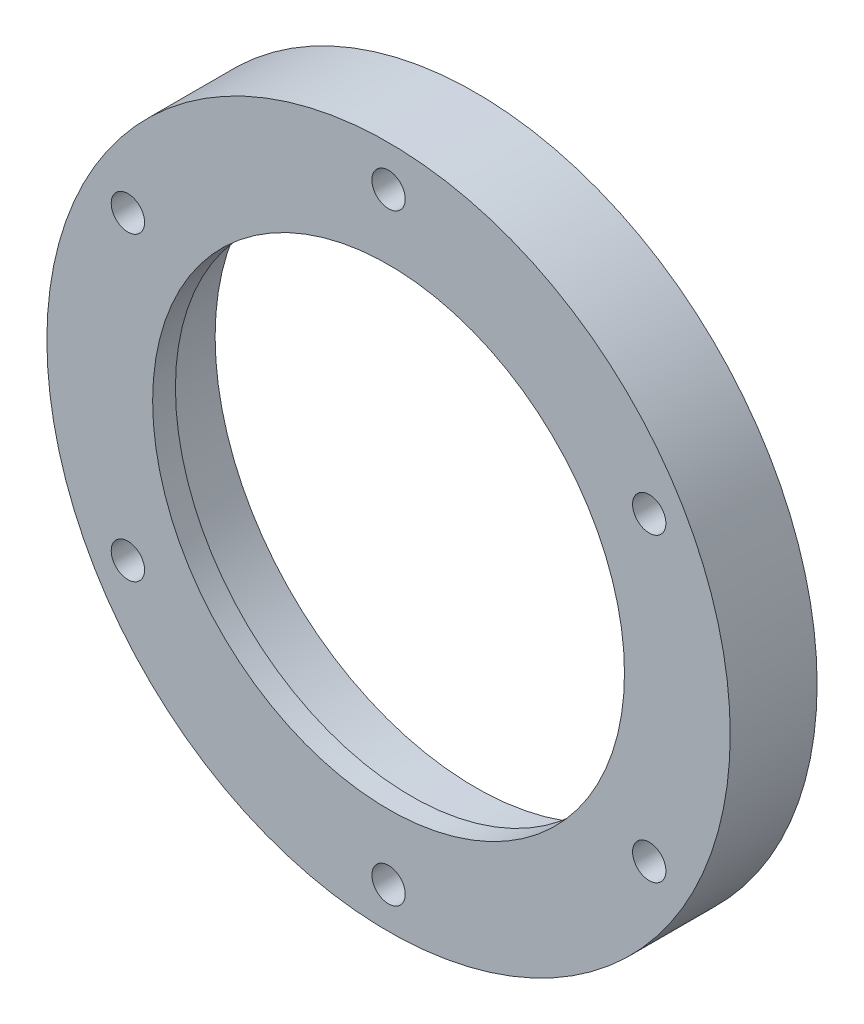
ISO-10303-21;
HEADER;
FILE_DESCRIPTION(('STEP AP214'),'2;1');
FILE_NAME('part.step','',(''),(''),'','','');
FILE_SCHEMA(('AUTOMOTIVE_DESIGN { 1 0 10303 214 1 1 1 1 }'));
ENDSEC;
DATA;
#1=APPLICATION_CONTEXT('core data for automotive mechanical design processes');
#2=APPLICATION_PROTOCOL_DEFINITION('international standard','automotive_design',2000,#1);
#3=PRODUCT_CONTEXT('',#1,'mechanical');
#4=PRODUCT('Part','Part','',(#3));
#5=PRODUCT_RELATED_PRODUCT_CATEGORY('part','',(#4));
#6=PRODUCT_DEFINITION_FORMATION('','',#4);
#7=PRODUCT_DEFINITION_CONTEXT('part definition',#1,'design');
#8=PRODUCT_DEFINITION('design','',#6,#7);
#9=PRODUCT_DEFINITION_SHAPE('','',#8);
#10=(LENGTH_UNIT() NAMED_UNIT(*) SI_UNIT(.MILLI.,.METRE.));
#11=(NAMED_UNIT(*) PLANE_ANGLE_UNIT() SI_UNIT($,.RADIAN.));
#12=(NAMED_UNIT(*) SI_UNIT($,.STERADIAN.) SOLID_ANGLE_UNIT());
#13=UNCERTAINTY_MEASURE_WITH_UNIT(LENGTH_MEASURE(1.E-05),#10,'distance_accuracy_value','');
#14=(GEOMETRIC_REPRESENTATION_CONTEXT(3) GLOBAL_UNCERTAINTY_ASSIGNED_CONTEXT((#13)) GLOBAL_UNIT_ASSIGNED_CONTEXT((#10,
#11,#12)) REPRESENTATION_CONTEXT('',''));
#15=CARTESIAN_POINT('',(0.,0.,0.));
#16=DIRECTION('',(0.,0.,1.));
#17=DIRECTION('',(1.,0.,0.));
#18=AXIS2_PLACEMENT_3D('',#15,#16,#17);
#19=CARTESIAN_POINT('',(0.,0.,-1.97));
#20=DIRECTION('',(0.,0.,1.));
#21=DIRECTION('',(1.,0.,0.));
#22=AXIS2_PLACEMENT_3D('',#19,#20,#21);
#23=PLANE('',#22);
#24=CARTESIAN_POINT('',(-16.021469970012,9.25000000000019,-1.97));
#25=DIRECTION('',(0.,0.,-1.));
#26=DIRECTION('',(-1.,0.,0.));
#27=AXIS2_PLACEMENT_3D('',#24,#25,#26);
#28=CIRCLE('',#27,1.02499999999999);
#29=CARTESIAN_POINT('',(-17.046469970012,9.25000000000019,-1.97));
#30=VERTEX_POINT('',#29);
#31=EDGE_CURVE('E95',#30,#30,#28,.T.);
#32=ORIENTED_EDGE('',*,*,#31,.F.);
#33=EDGE_LOOP('',(#32));
#34=FACE_BOUND('',#33,.T.);
#35=CARTESIAN_POINT('',(-16.0214699700122,-9.24999999999985,-1.97));
#36=DIRECTION('',(0.,0.,-1.));
#37=DIRECTION('',(-1.,0.,0.));
#38=AXIS2_PLACEMENT_3D('',#35,#36,#37);
#39=CIRCLE('',#38,1.02499999999999);
#40=CARTESIAN_POINT('',(-17.0464699700122,-9.24999999999985,-1.97));
#41=VERTEX_POINT('',#40);
#42=EDGE_CURVE('E89',#41,#41,#39,.T.);
#43=ORIENTED_EDGE('',*,*,#42,.F.);
#44=EDGE_LOOP('',(#43));
#45=FACE_BOUND('',#44,.T.);
#46=CARTESIAN_POINT('',(0.,-18.5,-1.97));
#47=DIRECTION('',(0.,0.,-1.));
#48=DIRECTION('',(-1.,0.,0.));
#49=AXIS2_PLACEMENT_3D('',#46,#47,#48);
#50=CIRCLE('',#49,1.02499999999999);
#51=CARTESIAN_POINT('',(-1.02499999999999,-18.5,-1.97));
#52=VERTEX_POINT('',#51);
#53=EDGE_CURVE('E83',#52,#52,#50,.T.);
#54=ORIENTED_EDGE('',*,*,#53,.F.);
#55=EDGE_LOOP('',(#54));
#56=FACE_BOUND('',#55,.T.);
#57=CARTESIAN_POINT('',(16.0214699700121,9.24999999999996,-1.97));
#58=DIRECTION('',(0.,0.,-1.));
#59=DIRECTION('',(-1.,0.,0.));
#60=AXIS2_PLACEMENT_3D('',#57,#58,#59);
#61=CIRCLE('',#60,1.02499999999999);
#62=CARTESIAN_POINT('',(14.9964699700121,9.24999999999996,-1.97));
#63=VERTEX_POINT('',#62);
#64=EDGE_CURVE('E71',#63,#63,#61,.T.);
#65=ORIENTED_EDGE('',*,*,#64,.F.);
#66=EDGE_LOOP('',(#65));
#67=FACE_BOUND('',#66,.T.);
#68=CARTESIAN_POINT('',(0.,18.5,-1.97));
#69=DIRECTION('',(0.,0.,-1.));
#70=DIRECTION('',(-1.,0.,0.));
#71=AXIS2_PLACEMENT_3D('',#68,#69,#70);
#72=CIRCLE('',#71,1.02499999999999);
#73=CARTESIAN_POINT('',(-1.02499999999999,18.5,-1.97));
#74=VERTEX_POINT('',#73);
#75=EDGE_CURVE('E65',#74,#74,#72,.T.);
#76=ORIENTED_EDGE('',*,*,#75,.F.);
#77=EDGE_LOOP('',(#76));
#78=FACE_BOUND('',#77,.T.);
#79=CARTESIAN_POINT('',(0.,0.,-1.97));
#80=DIRECTION('',(0.,0.,1.));
#81=DIRECTION('',(1.,0.,0.));
#82=AXIS2_PLACEMENT_3D('',#79,#80,#81);
#83=CIRCLE('',#82,21.);
#84=CARTESIAN_POINT('',(21.,0.,-1.97));
#85=VERTEX_POINT('',#84);
#86=EDGE_CURVE('E10',#85,#85,#83,.T.);
#87=ORIENTED_EDGE('',*,*,#86,.F.);
#88=EDGE_LOOP('',(#87));
#89=FACE_BOUND('',#88,.T.);
#90=CARTESIAN_POINT('',(0.,0.,-1.97));
#91=DIRECTION('',(0.,0.,1.));
#92=DIRECTION('',(1.,0.,0.));
#93=AXIS2_PLACEMENT_3D('',#90,#91,#92);
#94=CIRCLE('',#93,16.);
#95=CARTESIAN_POINT('',(16.,0.,-1.97));
#96=VERTEX_POINT('',#95);
#97=EDGE_CURVE('E43',#96,#96,#94,.T.);
#98=ORIENTED_EDGE('',*,*,#97,.T.);
#99=EDGE_LOOP('',(#98));
#100=FACE_BOUND('',#99,.T.);
#101=CARTESIAN_POINT('',(16.0214699700121,-9.25000000000008,-1.97));
#102=DIRECTION('',(0.,0.,-1.));
#103=DIRECTION('',(-1.,0.,0.));
#104=AXIS2_PLACEMENT_3D('',#101,#102,#103);
#105=CIRCLE('',#104,1.02499999999999);
#106=CARTESIAN_POINT('',(14.9964699700121,-9.25000000000008,-1.97));
#107=VERTEX_POINT('',#106);
#108=EDGE_CURVE('E77',#107,#107,#105,.T.);
#109=ORIENTED_EDGE('',*,*,#108,.F.);
#110=EDGE_LOOP('',(#109));
#111=FACE_BOUND('',#110,.T.);
#112=ADVANCED_FACE('F36',(#34,#45,#56,#67,#78,#89,#100,#111),#23,.F.);
#113=CARTESIAN_POINT('',(0.,0.,3.37));
#114=DIRECTION('',(0.,0.,1.));
#115=DIRECTION('',(1.,0.,0.));
#116=AXIS2_PLACEMENT_3D('',#113,#114,#115);
#117=PLANE('',#116);
#118=CARTESIAN_POINT('',(-16.021469970012,9.25000000000019,3.37));
#119=DIRECTION('',(0.,0.,-1.));
#120=DIRECTION('',(-1.,0.,0.));
#121=AXIS2_PLACEMENT_3D('',#118,#119,#120);
#122=CIRCLE('',#121,1.025);
#123=CARTESIAN_POINT('',(-17.046469970012,9.25000000000019,3.37));
#124=VERTEX_POINT('',#123);
#125=EDGE_CURVE('E92',#124,#124,#122,.T.);
#126=ORIENTED_EDGE('',*,*,#125,.T.);
#127=EDGE_LOOP('',(#126));
#128=FACE_BOUND('',#127,.T.);
#129=CARTESIAN_POINT('',(-16.0214699700122,-9.24999999999985,3.37));
#130=DIRECTION('',(0.,0.,-1.));
#131=DIRECTION('',(-1.,0.,0.));
#132=AXIS2_PLACEMENT_3D('',#129,#130,#131);
#133=CIRCLE('',#132,1.025);
#134=CARTESIAN_POINT('',(-17.0464699700122,-9.24999999999985,3.37));
#135=VERTEX_POINT('',#134);
#136=EDGE_CURVE('E86',#135,#135,#133,.T.);
#137=ORIENTED_EDGE('',*,*,#136,.T.);
#138=EDGE_LOOP('',(#137));
#139=FACE_BOUND('',#138,.T.);
#140=CARTESIAN_POINT('',(0.,-18.5,3.37));
#141=DIRECTION('',(0.,0.,-1.));
#142=DIRECTION('',(-1.,0.,0.));
#143=AXIS2_PLACEMENT_3D('',#140,#141,#142);
#144=CIRCLE('',#143,1.025);
#145=CARTESIAN_POINT('',(-1.025,-18.5,3.37));
#146=VERTEX_POINT('',#145);
#147=EDGE_CURVE('E80',#146,#146,#144,.T.);
#148=ORIENTED_EDGE('',*,*,#147,.T.);
#149=EDGE_LOOP('',(#148));
#150=FACE_BOUND('',#149,.T.);
#151=CARTESIAN_POINT('',(16.0214699700121,-9.25000000000008,3.37));
#152=DIRECTION('',(0.,0.,-1.));
#153=DIRECTION('',(-1.,0.,0.));
#154=AXIS2_PLACEMENT_3D('',#151,#152,#153);
#155=CIRCLE('',#154,1.025);
#156=CARTESIAN_POINT('',(14.9964699700121,-9.25000000000008,3.37));
#157=VERTEX_POINT('',#156);
#158=EDGE_CURVE('E74',#157,#157,#155,.T.);
#159=ORIENTED_EDGE('',*,*,#158,.T.);
#160=EDGE_LOOP('',(#159));
#161=FACE_BOUND('',#160,.T.);
#162=CARTESIAN_POINT('',(0.,0.,3.37));
#163=DIRECTION('',(0.,0.,1.));
#164=DIRECTION('',(1.,0.,0.));
#165=AXIS2_PLACEMENT_3D('',#162,#163,#164);
#166=CIRCLE('',#165,14.5);
#167=CARTESIAN_POINT('',(14.5,0.,3.37));
#168=VERTEX_POINT('',#167);
#169=EDGE_CURVE('E56',#168,#168,#166,.T.);
#170=ORIENTED_EDGE('',*,*,#169,.F.);
#171=EDGE_LOOP('',(#170));
#172=FACE_BOUND('',#171,.T.);
#173=CARTESIAN_POINT('',(0.,0.,3.37));
#174=DIRECTION('',(0.,0.,1.));
#175=DIRECTION('',(1.,0.,0.));
#176=AXIS2_PLACEMENT_3D('',#173,#174,#175);
#177=CIRCLE('',#176,21.);
#178=CARTESIAN_POINT('',(21.,0.,3.37));
#179=VERTEX_POINT('',#178);
#180=EDGE_CURVE('E51',#179,#179,#177,.T.);
#181=ORIENTED_EDGE('',*,*,#180,.T.);
#182=EDGE_LOOP('',(#181));
#183=FACE_BOUND('',#182,.T.);
#184=CARTESIAN_POINT('',(0.,18.5,3.37));
#185=DIRECTION('',(0.,0.,-1.));
#186=DIRECTION('',(-1.,0.,0.));
#187=AXIS2_PLACEMENT_3D('',#184,#185,#186);
#188=CIRCLE('',#187,1.025);
#189=CARTESIAN_POINT('',(-1.025,18.5,3.37));
#190=VERTEX_POINT('',#189);
#191=EDGE_CURVE('E60',#190,#190,#188,.T.);
#192=ORIENTED_EDGE('',*,*,#191,.T.);
#193=EDGE_LOOP('',(#192));
#194=FACE_BOUND('',#193,.T.);
#195=CARTESIAN_POINT('',(16.0214699700121,9.24999999999996,3.37));
#196=DIRECTION('',(0.,0.,-1.));
#197=DIRECTION('',(-1.,0.,0.));
#198=AXIS2_PLACEMENT_3D('',#195,#196,#197);
#199=CIRCLE('',#198,1.025);
#200=CARTESIAN_POINT('',(14.9964699700121,9.24999999999996,3.37));
#201=VERTEX_POINT('',#200);
#202=EDGE_CURVE('E68',#201,#201,#199,.T.);
#203=ORIENTED_EDGE('',*,*,#202,.T.);
#204=EDGE_LOOP('',(#203));
#205=FACE_BOUND('',#204,.T.);
#206=ADVANCED_FACE('F103',(#128,#139,#150,#161,#172,#183,#194,#205),#117,.T.);
#207=CARTESIAN_POINT('',(0.,0.,1.97));
#208=DIRECTION('',(0.,0.,-1.));
#209=DIRECTION('',(-1.,0.,0.));
#210=AXIS2_PLACEMENT_3D('',#207,#208,#209);
#211=CYLINDRICAL_SURFACE('',#210,21.);
#212=ORIENTED_EDGE('',*,*,#86,.T.);
#213=EDGE_LOOP('',(#212));
#214=FACE_BOUND('',#213,.T.);
#215=ORIENTED_EDGE('',*,*,#180,.F.);
#216=EDGE_LOOP('',(#215));
#217=FACE_BOUND('',#216,.T.);
#218=ADVANCED_FACE('F38',(#214,#217),#211,.T.);
#219=CARTESIAN_POINT('',(0.,0.,1.97));
#220=DIRECTION('',(0.,0.,-1.));
#221=DIRECTION('',(-1.,0.,0.));
#222=AXIS2_PLACEMENT_3D('',#219,#220,#221);
#223=CYLINDRICAL_SURFACE('',#222,16.);
#224=CARTESIAN_POINT('',(0.,0.,1.97));
#225=DIRECTION('',(0.,0.,1.));
#226=DIRECTION('',(1.,0.,0.));
#227=AXIS2_PLACEMENT_3D('',#224,#225,#226);
#228=CIRCLE('',#227,16.);
#229=CARTESIAN_POINT('',(16.,0.,1.97));
#230=VERTEX_POINT('',#229);
#231=EDGE_CURVE('E47',#230,#230,#228,.T.);
#232=ORIENTED_EDGE('',*,*,#231,.T.);
#233=EDGE_LOOP('',(#232));
#234=FACE_BOUND('',#233,.T.);
#235=ORIENTED_EDGE('',*,*,#97,.F.);
#236=EDGE_LOOP('',(#235));
#237=FACE_BOUND('',#236,.T.);
#238=ADVANCED_FACE('F147',(#234,#237),#223,.F.);
#239=CARTESIAN_POINT('',(0.,0.,1.97));
#240=DIRECTION('',(0.,0.,1.));
#241=DIRECTION('',(1.,0.,0.));
#242=AXIS2_PLACEMENT_3D('',#239,#240,#241);
#243=PLANE('',#242);
#244=CARTESIAN_POINT('',(0.,0.,1.97));
#245=DIRECTION('',(0.,0.,1.));
#246=DIRECTION('',(1.,0.,0.));
#247=AXIS2_PLACEMENT_3D('',#244,#245,#246);
#248=CIRCLE('',#247,14.5);
#249=CARTESIAN_POINT('',(14.5,0.,1.97));
#250=VERTEX_POINT('',#249);
#251=EDGE_CURVE('E57',#250,#250,#248,.T.);
#252=ORIENTED_EDGE('',*,*,#251,.T.);
#253=EDGE_LOOP('',(#252));
#254=FACE_BOUND('',#253,.T.);
#255=ORIENTED_EDGE('',*,*,#231,.F.);
#256=EDGE_LOOP('',(#255));
#257=FACE_BOUND('',#256,.T.);
#258=ADVANCED_FACE('F140',(#254,#257),#243,.F.);
#259=CARTESIAN_POINT('',(0.,0.,3.37));
#260=DIRECTION('',(0.,0.,-1.));
#261=DIRECTION('',(-1.,0.,0.));
#262=AXIS2_PLACEMENT_3D('',#259,#260,#261);
#263=CYLINDRICAL_SURFACE('',#262,14.5);
#264=ORIENTED_EDGE('',*,*,#169,.T.);
#265=EDGE_LOOP('',(#264));
#266=FACE_BOUND('',#265,.T.);
#267=ORIENTED_EDGE('',*,*,#251,.F.);
#268=EDGE_LOOP('',(#267));
#269=FACE_BOUND('',#268,.T.);
#270=ADVANCED_FACE('F136',(#266,#269),#263,.F.);
#271=CARTESIAN_POINT('',(0.,18.5,-1.97));
#272=DIRECTION('',(0.,0.,-1.));
#273=DIRECTION('',(-1.,0.,0.));
#274=AXIS2_PLACEMENT_3D('',#271,#272,#273);
#275=CYLINDRICAL_SURFACE('',#274,1.02499999999999);
#276=ORIENTED_EDGE('',*,*,#191,.F.);
#277=EDGE_LOOP('',(#276));
#278=FACE_BOUND('',#277,.T.);
#279=ORIENTED_EDGE('',*,*,#75,.T.);
#280=EDGE_LOOP('',(#279));
#281=FACE_BOUND('',#280,.T.);
#282=ADVANCED_FACE('F128',(#278,#281),#275,.F.);
#283=CARTESIAN_POINT('',(16.0214699700121,9.24999999999996,-1.97));
#284=DIRECTION('',(0.,0.,-1.));
#285=DIRECTION('',(-1.,0.,0.));
#286=AXIS2_PLACEMENT_3D('',#283,#284,#285);
#287=CYLINDRICAL_SURFACE('',#286,1.02499999999999);
#288=ORIENTED_EDGE('',*,*,#202,.F.);
#289=EDGE_LOOP('',(#288));
#290=FACE_BOUND('',#289,.T.);
#291=ORIENTED_EDGE('',*,*,#64,.T.);
#292=EDGE_LOOP('',(#291));
#293=FACE_BOUND('',#292,.T.);
#294=ADVANCED_FACE('F118',(#290,#293),#287,.F.);
#295=CARTESIAN_POINT('',(16.0214699700121,-9.25000000000008,-1.97));
#296=DIRECTION('',(0.,0.,-1.));
#297=DIRECTION('',(-1.,0.,0.));
#298=AXIS2_PLACEMENT_3D('',#295,#296,#297);
#299=CYLINDRICAL_SURFACE('',#298,1.02499999999999);
#300=ORIENTED_EDGE('',*,*,#158,.F.);
#301=EDGE_LOOP('',(#300));
#302=FACE_BOUND('',#301,.T.);
#303=ORIENTED_EDGE('',*,*,#108,.T.);
#304=EDGE_LOOP('',(#303));
#305=FACE_BOUND('',#304,.T.);
#306=ADVANCED_FACE('F115',(#302,#305),#299,.F.);
#307=CARTESIAN_POINT('',(0.,-18.5,-1.97));
#308=DIRECTION('',(0.,0.,-1.));
#309=DIRECTION('',(-1.,0.,0.));
#310=AXIS2_PLACEMENT_3D('',#307,#308,#309);
#311=CYLINDRICAL_SURFACE('',#310,1.02499999999999);
#312=ORIENTED_EDGE('',*,*,#147,.F.);
#313=EDGE_LOOP('',(#312));
#314=FACE_BOUND('',#313,.T.);
#315=ORIENTED_EDGE('',*,*,#53,.T.);
#316=EDGE_LOOP('',(#315));
#317=FACE_BOUND('',#316,.T.);
#318=ADVANCED_FACE('F117',(#314,#317),#311,.F.);
#319=CARTESIAN_POINT('',(-16.0214699700122,-9.24999999999985,-1.97));
#320=DIRECTION('',(0.,0.,-1.));
#321=DIRECTION('',(-1.,0.,0.));
#322=AXIS2_PLACEMENT_3D('',#319,#320,#321);
#323=CYLINDRICAL_SURFACE('',#322,1.02499999999999);
#324=ORIENTED_EDGE('',*,*,#136,.F.);
#325=EDGE_LOOP('',(#324));
#326=FACE_BOUND('',#325,.T.);
#327=ORIENTED_EDGE('',*,*,#42,.T.);
#328=EDGE_LOOP('',(#327));
#329=FACE_BOUND('',#328,.T.);
#330=ADVANCED_FACE('F125',(#326,#329),#323,.F.);
#331=CARTESIAN_POINT('',(-16.021469970012,9.25000000000019,-1.97));
#332=DIRECTION('',(0.,0.,-1.));
#333=DIRECTION('',(-1.,0.,0.));
#334=AXIS2_PLACEMENT_3D('',#331,#332,#333);
#335=CYLINDRICAL_SURFACE('',#334,1.02499999999999);
#336=ORIENTED_EDGE('',*,*,#125,.F.);
#337=EDGE_LOOP('',(#336));
#338=FACE_BOUND('',#337,.T.);
#339=ORIENTED_EDGE('',*,*,#31,.T.);
#340=EDGE_LOOP('',(#339));
#341=FACE_BOUND('',#340,.T.);
#342=ADVANCED_FACE('F99',(#338,#341),#335,.F.);
#343=CLOSED_SHELL('',(#112,#206,#218,#238,#258,#270,#282,#294,#306,#318,#330,#342));
#344=MANIFOLD_SOLID_BREP('B2',#343);
#345=ADVANCED_BREP_SHAPE_REPRESENTATION('',(#18,#344),#14);
#346=SHAPE_DEFINITION_REPRESENTATION(#9,#345);
ENDSEC;
END-ISO-10303-21;
